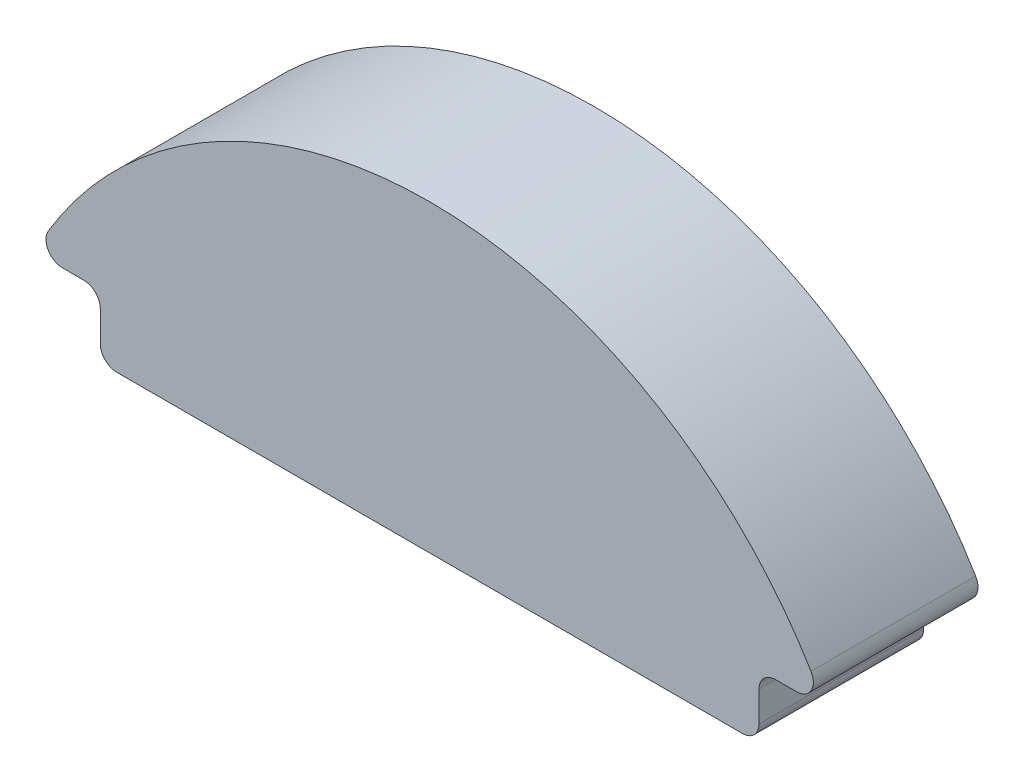
ISO-10303-21;
HEADER;
FILE_DESCRIPTION(('STEP AP214'),'2;1');
FILE_NAME('part.step','',(''),(''),'','','');
FILE_SCHEMA(('AUTOMOTIVE_DESIGN { 1 0 10303 214 1 1 1 1 }'));
ENDSEC;
DATA;
#1=APPLICATION_CONTEXT('core data for automotive mechanical design processes');
#2=APPLICATION_PROTOCOL_DEFINITION('international standard','automotive_design',2000,#1);
#3=PRODUCT_CONTEXT('',#1,'mechanical');
#4=PRODUCT('Part','Part','',(#3));
#5=PRODUCT_RELATED_PRODUCT_CATEGORY('part','',(#4));
#6=PRODUCT_DEFINITION_FORMATION('','',#4);
#7=PRODUCT_DEFINITION_CONTEXT('part definition',#1,'design');
#8=PRODUCT_DEFINITION('design','',#6,#7);
#9=PRODUCT_DEFINITION_SHAPE('','',#8);
#10=(LENGTH_UNIT() NAMED_UNIT(*) SI_UNIT(.MILLI.,.METRE.));
#11=(NAMED_UNIT(*) PLANE_ANGLE_UNIT() SI_UNIT($,.RADIAN.));
#12=(NAMED_UNIT(*) SI_UNIT($,.STERADIAN.) SOLID_ANGLE_UNIT());
#13=UNCERTAINTY_MEASURE_WITH_UNIT(LENGTH_MEASURE(1.E-05),#10,'distance_accuracy_value','');
#14=(GEOMETRIC_REPRESENTATION_CONTEXT(3) GLOBAL_UNCERTAINTY_ASSIGNED_CONTEXT((#13)) GLOBAL_UNIT_ASSIGNED_CONTEXT((#10,
#11,#12)) REPRESENTATION_CONTEXT('',''));
#15=CARTESIAN_POINT('',(0.,0.,0.));
#16=DIRECTION('',(0.,0.,1.));
#17=DIRECTION('',(1.,0.,0.));
#18=AXIS2_PLACEMENT_3D('',#15,#16,#17);
#19=CARTESIAN_POINT('',(127.386676948972,24.2,50.));
#20=DIRECTION('',(0.,0.,-1.));
#21=DIRECTION('',(-1.,0.,0.));
#22=AXIS2_PLACEMENT_3D('',#19,#20,#21);
#23=CYLINDRICAL_SURFACE('',#22,5.);
#24=CARTESIAN_POINT('',(127.386676948972,24.2,0.));
#25=DIRECTION('',(0.,0.,1.));
#26=DIRECTION('',(1.,0.,0.));
#27=AXIS2_PLACEMENT_3D('',#24,#25,#26);
#28=CIRCLE('',#27,5.);
#29=CARTESIAN_POINT('',(127.386676948972,19.2,0.));
#30=VERTEX_POINT('',#29);
#31=CARTESIAN_POINT('',(131.67501502173,26.7710224763179,0.));
#32=VERTEX_POINT('',#31);
#33=EDGE_CURVE('E248',#30,#32,#28,.T.);
#34=ORIENTED_EDGE('',*,*,#33,.T.);
#35=DIRECTION('',(0.,0.,-1.));
#36=VECTOR('',#35,1.);
#37=CARTESIAN_POINT('',(131.67501502173,26.7710224763179,50.));
#38=LINE('',#37,#36);
#39=CARTESIAN_POINT('',(131.67501502173,26.7710224763179,50.));
#40=VERTEX_POINT('',#39);
#41=EDGE_CURVE('E295',#40,#32,#38,.T.);
#42=ORIENTED_EDGE('',*,*,#41,.F.);
#43=CARTESIAN_POINT('',(127.386676948972,24.2,50.));
#44=DIRECTION('',(0.,0.,1.));
#45=DIRECTION('',(1.,0.,0.));
#46=AXIS2_PLACEMENT_3D('',#43,#44,#45);
#47=CIRCLE('',#46,5.);
#48=CARTESIAN_POINT('',(127.386676948972,19.2,50.));
#49=VERTEX_POINT('',#48);
#50=EDGE_CURVE('E270',#49,#40,#47,.T.);
#51=ORIENTED_EDGE('',*,*,#50,.F.);
#52=DIRECTION('',(0.,0.,-1.));
#53=VECTOR('',#52,1.);
#54=CARTESIAN_POINT('',(127.386676948972,19.2,50.));
#55=LINE('',#54,#53);
#56=EDGE_CURVE('E244',#49,#30,#55,.T.);
#57=ORIENTED_EDGE('',*,*,#56,.T.);
#58=EDGE_LOOP('',(#34,#42,#51,#57));
#59=FACE_BOUND('',#58,.T.);
#60=ADVANCED_FACE('F40',(#59),#23,.T.);
#61=CARTESIAN_POINT('',(15.8898870572563,-42.6465843842649,50.));
#62=DIRECTION('',(0.,0.,-1.));
#63=DIRECTION('',(-1.,0.,0.));
#64=AXIS2_PLACEMENT_3D('',#61,#62,#63);
#65=CYLINDRICAL_SURFACE('',#64,135.);
#66=CARTESIAN_POINT('',(15.8898870572563,-42.6465843842649,0.));
#67=DIRECTION('',(0.,0.,1.));
#68=DIRECTION('',(-1.,0.,0.));
#69=AXIS2_PLACEMENT_3D('',#66,#67,#68);
#70=CIRCLE('',#69,135.);
#71=CARTESIAN_POINT('',(-99.8952409072175,26.7710224763179,0.));
#72=VERTEX_POINT('',#71);
#73=EDGE_CURVE('E251',#32,#72,#70,.T.);
#74=ORIENTED_EDGE('',*,*,#73,.T.);
#75=DIRECTION('',(0.,0.,-1.));
#76=VECTOR('',#75,1.);
#77=CARTESIAN_POINT('',(-99.8952409072175,26.7710224763179,50.));
#78=LINE('',#77,#76);
#79=CARTESIAN_POINT('',(-99.8952409072175,26.7710224763179,50.));
#80=VERTEX_POINT('',#79);
#81=EDGE_CURVE('E292',#80,#72,#78,.T.);
#82=ORIENTED_EDGE('',*,*,#81,.F.);
#83=CARTESIAN_POINT('',(15.8898870572563,-42.6465843842649,50.));
#84=DIRECTION('',(0.,0.,1.));
#85=DIRECTION('',(-1.,0.,0.));
#86=AXIS2_PLACEMENT_3D('',#83,#84,#85);
#87=CIRCLE('',#86,135.);
#88=EDGE_CURVE('E199',#40,#80,#87,.T.);
#89=ORIENTED_EDGE('',*,*,#88,.F.);
#90=ORIENTED_EDGE('',*,*,#41,.T.);
#91=EDGE_LOOP('',(#74,#82,#89,#90));
#92=FACE_BOUND('',#91,.T.);
#93=ADVANCED_FACE('F631',(#92),#65,.T.);
#94=CARTESIAN_POINT('',(-95.6069028344592,24.2,50.));
#95=DIRECTION('',(0.,0.,-1.));
#96=DIRECTION('',(-1.,0.,0.));
#97=AXIS2_PLACEMENT_3D('',#94,#95,#96);
#98=CYLINDRICAL_SURFACE('',#97,5.);
#99=CARTESIAN_POINT('',(-95.6069028344592,24.2,0.));
#100=DIRECTION('',(0.,0.,1.));
#101=DIRECTION('',(-1.,0.,0.));
#102=AXIS2_PLACEMENT_3D('',#99,#100,#101);
#103=CIRCLE('',#102,5.);
#104=CARTESIAN_POINT('',(-95.6069028344592,19.2,0.));
#105=VERTEX_POINT('',#104);
#106=EDGE_CURVE('E253',#72,#105,#103,.T.);
#107=ORIENTED_EDGE('',*,*,#106,.T.);
#108=DIRECTION('',(0.,0.,-1.));
#109=VECTOR('',#108,1.);
#110=CARTESIAN_POINT('',(-95.6069028344592,19.2,50.));
#111=LINE('',#110,#109);
#112=CARTESIAN_POINT('',(-95.6069028344592,19.2,50.));
#113=VERTEX_POINT('',#112);
#114=EDGE_CURVE('E289',#113,#105,#111,.T.);
#115=ORIENTED_EDGE('',*,*,#114,.F.);
#116=CARTESIAN_POINT('',(-95.6069028344592,24.2,50.));
#117=DIRECTION('',(0.,0.,1.));
#118=DIRECTION('',(-1.,0.,0.));
#119=AXIS2_PLACEMENT_3D('',#116,#117,#118);
#120=CIRCLE('',#119,5.);
#121=EDGE_CURVE('E682',#80,#113,#120,.T.);
#122=ORIENTED_EDGE('',*,*,#121,.F.);
#123=ORIENTED_EDGE('',*,*,#81,.T.);
#124=EDGE_LOOP('',(#107,#115,#122,#123));
#125=FACE_BOUND('',#124,.T.);
#126=ADVANCED_FACE('F622',(#125),#98,.T.);
#127=CARTESIAN_POINT('',(-89.1101129427438,19.2,50.));
#128=DIRECTION('',(0.,1.,0.));
#129=DIRECTION('',(0.,0.,1.));
#130=AXIS2_PLACEMENT_3D('',#127,#128,#129);
#131=PLANE('',#130);
#132=DIRECTION('',(1.,0.,0.));
#133=VECTOR('',#132,1.);
#134=CARTESIAN_POINT('',(-89.1101129427438,19.2,0.));
#135=LINE('',#134,#133);
#136=CARTESIAN_POINT('',(-89.1101129427438,19.2,0.));
#137=VERTEX_POINT('',#136);
#138=EDGE_CURVE('E255',#105,#137,#135,.T.);
#139=ORIENTED_EDGE('',*,*,#138,.T.);
#140=DIRECTION('',(0.,0.,-1.));
#141=VECTOR('',#140,1.);
#142=CARTESIAN_POINT('',(-89.1101129427438,19.2,50.));
#143=LINE('',#142,#141);
#144=CARTESIAN_POINT('',(-89.1101129427438,19.2,50.));
#145=VERTEX_POINT('',#144);
#146=EDGE_CURVE('E286',#145,#137,#143,.T.);
#147=ORIENTED_EDGE('',*,*,#146,.F.);
#148=DIRECTION('',(1.,0.,0.));
#149=VECTOR('',#148,1.);
#150=CARTESIAN_POINT('',(-89.1101129427438,19.2,50.));
#151=LINE('',#150,#149);
#152=EDGE_CURVE('E684',#113,#145,#151,.T.);
#153=ORIENTED_EDGE('',*,*,#152,.F.);
#154=ORIENTED_EDGE('',*,*,#114,.T.);
#155=EDGE_LOOP('',(#139,#147,#153,#154));
#156=FACE_BOUND('',#155,.T.);
#157=ADVANCED_FACE('F613',(#156),#131,.F.);
#158=CARTESIAN_POINT('',(-89.1101129427438,14.2,50.));
#159=DIRECTION('',(0.,0.,-1.));
#160=DIRECTION('',(-1.,0.,0.));
#161=AXIS2_PLACEMENT_3D('',#158,#159,#160);
#162=CYLINDRICAL_SURFACE('',#161,5.);
#163=CARTESIAN_POINT('',(-89.1101129427438,14.2,0.));
#164=DIRECTION('',(0.,0.,-1.));
#165=DIRECTION('',(1.,0.,0.));
#166=AXIS2_PLACEMENT_3D('',#163,#164,#165);
#167=CIRCLE('',#166,5.);
#168=CARTESIAN_POINT('',(-84.1101129427437,14.2,0.));
#169=VERTEX_POINT('',#168);
#170=EDGE_CURVE('E257',#137,#169,#167,.T.);
#171=ORIENTED_EDGE('',*,*,#170,.T.);
#172=DIRECTION('',(0.,0.,-1.));
#173=VECTOR('',#172,1.);
#174=CARTESIAN_POINT('',(-84.1101129427437,14.2,50.));
#175=LINE('',#174,#173);
#176=CARTESIAN_POINT('',(-84.1101129427437,14.2,50.));
#177=VERTEX_POINT('',#176);
#178=EDGE_CURVE('E283',#177,#169,#175,.T.);
#179=ORIENTED_EDGE('',*,*,#178,.F.);
#180=CARTESIAN_POINT('',(-89.1101129427438,14.2,50.));
#181=DIRECTION('',(0.,0.,-1.));
#182=DIRECTION('',(1.,0.,0.));
#183=AXIS2_PLACEMENT_3D('',#180,#181,#182);
#184=CIRCLE('',#183,5.);
#185=EDGE_CURVE('E686',#145,#177,#184,.T.);
#186=ORIENTED_EDGE('',*,*,#185,.F.);
#187=ORIENTED_EDGE('',*,*,#146,.T.);
#188=EDGE_LOOP('',(#171,#179,#186,#187));
#189=FACE_BOUND('',#188,.T.);
#190=ADVANCED_FACE('F604',(#189),#162,.F.);
#191=CARTESIAN_POINT('',(-84.1101129427437,5.00000000000004,50.));
#192=DIRECTION('',(1.,0.,0.));
#193=DIRECTION('',(0.,0.,-1.));
#194=AXIS2_PLACEMENT_3D('',#191,#192,#193);
#195=PLANE('',#194);
#196=DIRECTION('',(0.,-1.,0.));
#197=VECTOR('',#196,1.);
#198=CARTESIAN_POINT('',(-84.1101129427437,5.00000000000004,0.));
#199=LINE('',#198,#197);
#200=CARTESIAN_POINT('',(-84.1101129427437,5.,0.));
#201=VERTEX_POINT('',#200);
#202=EDGE_CURVE('E259',#169,#201,#199,.T.);
#203=ORIENTED_EDGE('',*,*,#202,.T.);
#204=DIRECTION('',(0.,0.,-1.));
#205=VECTOR('',#204,1.);
#206=CARTESIAN_POINT('',(-84.1101129427437,5.,50.));
#207=LINE('',#206,#205);
#208=CARTESIAN_POINT('',(-84.1101129427437,5.,50.));
#209=VERTEX_POINT('',#208);
#210=EDGE_CURVE('E280',#209,#201,#207,.T.);
#211=ORIENTED_EDGE('',*,*,#210,.F.);
#212=DIRECTION('',(0.,-1.,0.));
#213=VECTOR('',#212,1.);
#214=CARTESIAN_POINT('',(-84.1101129427437,5.00000000000004,50.));
#215=LINE('',#214,#213);
#216=EDGE_CURVE('E692',#177,#209,#215,.T.);
#217=ORIENTED_EDGE('',*,*,#216,.F.);
#218=ORIENTED_EDGE('',*,*,#178,.T.);
#219=EDGE_LOOP('',(#203,#211,#217,#218));
#220=FACE_BOUND('',#219,.T.);
#221=ADVANCED_FACE('F595',(#220),#195,.F.);
#222=CARTESIAN_POINT('',(-79.1101129427437,5.,50.));
#223=DIRECTION('',(0.,0.,-1.));
#224=DIRECTION('',(-1.,0.,0.));
#225=AXIS2_PLACEMENT_3D('',#222,#223,#224);
#226=CYLINDRICAL_SURFACE('',#225,5.);
#227=CARTESIAN_POINT('',(-79.1101129427437,5.,0.));
#228=DIRECTION('',(0.,0.,1.));
#229=DIRECTION('',(-1.,0.,0.));
#230=AXIS2_PLACEMENT_3D('',#227,#228,#229);
#231=CIRCLE('',#230,5.);
#232=CARTESIAN_POINT('',(-79.1101129427437,0.,0.));
#233=VERTEX_POINT('',#232);
#234=EDGE_CURVE('E261',#201,#233,#231,.T.);
#235=ORIENTED_EDGE('',*,*,#234,.T.);
#236=DIRECTION('',(0.,0.,-1.));
#237=VECTOR('',#236,1.);
#238=CARTESIAN_POINT('',(-79.1101129427437,0.,50.));
#239=LINE('',#238,#237);
#240=CARTESIAN_POINT('',(-79.1101129427437,0.,50.));
#241=VERTEX_POINT('',#240);
#242=EDGE_CURVE('E277',#241,#233,#239,.T.);
#243=ORIENTED_EDGE('',*,*,#242,.F.);
#244=CARTESIAN_POINT('',(-79.1101129427437,5.,50.));
#245=DIRECTION('',(0.,0.,1.));
#246=DIRECTION('',(-1.,0.,0.));
#247=AXIS2_PLACEMENT_3D('',#244,#245,#246);
#248=CIRCLE('',#247,5.);
#249=EDGE_CURVE('E694',#209,#241,#248,.T.);
#250=ORIENTED_EDGE('',*,*,#249,.F.);
#251=ORIENTED_EDGE('',*,*,#210,.T.);
#252=EDGE_LOOP('',(#235,#243,#250,#251));
#253=FACE_BOUND('',#252,.T.);
#254=ADVANCED_FACE('F586',(#253),#226,.T.);
#255=CARTESIAN_POINT('',(-79.1101129427437,0.,50.));
#256=DIRECTION('',(0.,1.,0.));
#257=DIRECTION('',(0.,0.,1.));
#258=AXIS2_PLACEMENT_3D('',#255,#256,#257);
#259=PLANE('',#258);
#260=DIRECTION('',(1.,0.,0.));
#261=VECTOR('',#260,1.);
#262=CARTESIAN_POINT('',(-79.1101129427437,0.,0.));
#263=LINE('',#262,#261);
#264=CARTESIAN_POINT('',(110.889887057256,0.,0.));
#265=VERTEX_POINT('',#264);
#266=EDGE_CURVE('E263',#233,#265,#263,.T.);
#267=ORIENTED_EDGE('',*,*,#266,.T.);
#268=DIRECTION('',(0.,0.,-1.));
#269=VECTOR('',#268,1.);
#270=CARTESIAN_POINT('',(110.889887057256,0.,50.));
#271=LINE('',#270,#269);
#272=CARTESIAN_POINT('',(110.889887057256,0.,50.));
#273=VERTEX_POINT('',#272);
#274=EDGE_CURVE('E274',#273,#265,#271,.T.);
#275=ORIENTED_EDGE('',*,*,#274,.F.);
#276=DIRECTION('',(1.,0.,0.));
#277=VECTOR('',#276,1.);
#278=CARTESIAN_POINT('',(-79.1101129427437,0.,50.));
#279=LINE('',#278,#277);
#280=EDGE_CURVE('E696',#241,#273,#279,.T.);
#281=ORIENTED_EDGE('',*,*,#280,.F.);
#282=ORIENTED_EDGE('',*,*,#242,.T.);
#283=EDGE_LOOP('',(#267,#275,#281,#282));
#284=FACE_BOUND('',#283,.T.);
#285=ADVANCED_FACE('F577',(#284),#259,.F.);
#286=CARTESIAN_POINT('',(110.889887057256,5.,50.));
#287=DIRECTION('',(0.,0.,-1.));
#288=DIRECTION('',(-1.,0.,0.));
#289=AXIS2_PLACEMENT_3D('',#286,#287,#288);
#290=CYLINDRICAL_SURFACE('',#289,5.);
#291=CARTESIAN_POINT('',(110.889887057256,5.,0.));
#292=DIRECTION('',(0.,0.,1.));
#293=DIRECTION('',(1.,0.,0.));
#294=AXIS2_PLACEMENT_3D('',#291,#292,#293);
#295=CIRCLE('',#294,5.);
#296=CARTESIAN_POINT('',(115.889887057256,5.00000000000003,0.));
#297=VERTEX_POINT('',#296);
#298=EDGE_CURVE('E265',#265,#297,#295,.T.);
#299=ORIENTED_EDGE('',*,*,#298,.T.);
#300=DIRECTION('',(0.,0.,-1.));
#301=VECTOR('',#300,1.);
#302=CARTESIAN_POINT('',(115.889887057256,5.00000000000003,50.));
#303=LINE('',#302,#301);
#304=CARTESIAN_POINT('',(115.889887057256,5.00000000000003,50.));
#305=VERTEX_POINT('',#304);
#306=EDGE_CURVE('E239',#305,#297,#303,.T.);
#307=ORIENTED_EDGE('',*,*,#306,.F.);
#308=CARTESIAN_POINT('',(110.889887057256,5.,50.));
#309=DIRECTION('',(0.,0.,1.));
#310=DIRECTION('',(1.,0.,0.));
#311=AXIS2_PLACEMENT_3D('',#308,#309,#310);
#312=CIRCLE('',#311,5.);
#313=EDGE_CURVE('E230',#273,#305,#312,.T.);
#314=ORIENTED_EDGE('',*,*,#313,.F.);
#315=ORIENTED_EDGE('',*,*,#274,.T.);
#316=EDGE_LOOP('',(#299,#307,#314,#315));
#317=FACE_BOUND('',#316,.T.);
#318=ADVANCED_FACE('F569',(#317),#290,.T.);
#319=CARTESIAN_POINT('',(115.889887057256,5.00000000000003,50.));
#320=DIRECTION('',(-1.,0.,0.));
#321=DIRECTION('',(0.,0.,1.));
#322=AXIS2_PLACEMENT_3D('',#319,#320,#321);
#323=PLANE('',#322);
#324=DIRECTION('',(0.,1.,0.));
#325=VECTOR('',#324,1.);
#326=CARTESIAN_POINT('',(115.889887057256,5.00000000000003,0.));
#327=LINE('',#326,#325);
#328=CARTESIAN_POINT('',(115.889887057256,14.2,0.));
#329=VERTEX_POINT('',#328);
#330=EDGE_CURVE('E238',#297,#329,#327,.T.);
#331=ORIENTED_EDGE('',*,*,#330,.T.);
#332=DIRECTION('',(0.,0.,-1.));
#333=VECTOR('',#332,1.);
#334=CARTESIAN_POINT('',(115.889887057256,14.2,50.));
#335=LINE('',#334,#333);
#336=CARTESIAN_POINT('',(115.889887057256,14.2,50.));
#337=VERTEX_POINT('',#336);
#338=EDGE_CURVE('E235',#337,#329,#335,.T.);
#339=ORIENTED_EDGE('',*,*,#338,.F.);
#340=DIRECTION('',(0.,1.,0.));
#341=VECTOR('',#340,1.);
#342=CARTESIAN_POINT('',(115.889887057256,5.00000000000003,50.));
#343=LINE('',#342,#341);
#344=EDGE_CURVE('E224',#305,#337,#343,.T.);
#345=ORIENTED_EDGE('',*,*,#344,.F.);
#346=ORIENTED_EDGE('',*,*,#306,.T.);
#347=EDGE_LOOP('',(#331,#339,#345,#346));
#348=FACE_BOUND('',#347,.T.);
#349=ADVANCED_FACE('F236',(#348),#323,.F.);
#350=CARTESIAN_POINT('',(120.889887057256,14.2,50.));
#351=DIRECTION('',(0.,0.,-1.));
#352=DIRECTION('',(-1.,0.,0.));
#353=AXIS2_PLACEMENT_3D('',#350,#351,#352);
#354=CYLINDRICAL_SURFACE('',#353,5.);
#355=CARTESIAN_POINT('',(120.889887057256,14.2,0.));
#356=DIRECTION('',(0.,0.,-1.));
#357=DIRECTION('',(-1.,0.,0.));
#358=AXIS2_PLACEMENT_3D('',#355,#356,#357);
#359=CIRCLE('',#358,5.);
#360=CARTESIAN_POINT('',(120.889887057256,19.2,0.));
#361=VERTEX_POINT('',#360);
#362=EDGE_CURVE('E184',#329,#361,#359,.T.);
#363=ORIENTED_EDGE('',*,*,#362,.T.);
#364=DIRECTION('',(0.,0.,-1.));
#365=VECTOR('',#364,1.);
#366=CARTESIAN_POINT('',(120.889887057256,19.2,50.));
#367=LINE('',#366,#365);
#368=CARTESIAN_POINT('',(120.889887057256,19.2,50.));
#369=VERTEX_POINT('',#368);
#370=EDGE_CURVE('E240',#369,#361,#367,.T.);
#371=ORIENTED_EDGE('',*,*,#370,.F.);
#372=CARTESIAN_POINT('',(120.889887057256,14.2,50.));
#373=DIRECTION('',(0.,0.,-1.));
#374=DIRECTION('',(-1.,0.,0.));
#375=AXIS2_PLACEMENT_3D('',#372,#373,#374);
#376=CIRCLE('',#375,5.);
#377=EDGE_CURVE('E228',#337,#369,#376,.T.);
#378=ORIENTED_EDGE('',*,*,#377,.F.);
#379=ORIENTED_EDGE('',*,*,#338,.T.);
#380=EDGE_LOOP('',(#363,#371,#378,#379));
#381=FACE_BOUND('',#380,.T.);
#382=ADVANCED_FACE('F242',(#381),#354,.F.);
#383=CARTESIAN_POINT('',(120.889887057256,19.2,50.));
#384=DIRECTION('',(0.,1.,0.));
#385=DIRECTION('',(0.,0.,1.));
#386=AXIS2_PLACEMENT_3D('',#383,#384,#385);
#387=PLANE('',#386);
#388=DIRECTION('',(1.,0.,0.));
#389=VECTOR('',#388,1.);
#390=CARTESIAN_POINT('',(120.889887057256,19.2,0.));
#391=LINE('',#390,#389);
#392=EDGE_CURVE('E190',#361,#30,#391,.T.);
#393=ORIENTED_EDGE('',*,*,#392,.T.);
#394=ORIENTED_EDGE('',*,*,#56,.F.);
#395=DIRECTION('',(1.,0.,0.));
#396=VECTOR('',#395,1.);
#397=CARTESIAN_POINT('',(120.889887057256,19.2,50.));
#398=LINE('',#397,#396);
#399=EDGE_CURVE('E143',#369,#49,#398,.T.);
#400=ORIENTED_EDGE('',*,*,#399,.F.);
#401=ORIENTED_EDGE('',*,*,#370,.T.);
#402=EDGE_LOOP('',(#393,#394,#400,#401));
#403=FACE_BOUND('',#402,.T.);
#404=ADVANCED_FACE('F546',(#403),#387,.F.);
#405=CARTESIAN_POINT('',(127.386676948972,24.2,50.));
#406=DIRECTION('',(0.,0.,1.));
#407=DIRECTION('',(1.,0.,0.));
#408=AXIS2_PLACEMENT_3D('',#405,#406,#407);
#409=PLANE('',#408);
#410=ORIENTED_EDGE('',*,*,#50,.T.);
#411=ORIENTED_EDGE('',*,*,#88,.T.);
#412=ORIENTED_EDGE('',*,*,#121,.T.);
#413=ORIENTED_EDGE('',*,*,#152,.T.);
#414=ORIENTED_EDGE('',*,*,#185,.T.);
#415=ORIENTED_EDGE('',*,*,#216,.T.);
#416=ORIENTED_EDGE('',*,*,#249,.T.);
#417=ORIENTED_EDGE('',*,*,#280,.T.);
#418=ORIENTED_EDGE('',*,*,#313,.T.);
#419=ORIENTED_EDGE('',*,*,#344,.T.);
#420=ORIENTED_EDGE('',*,*,#377,.T.);
#421=ORIENTED_EDGE('',*,*,#399,.T.);
#422=EDGE_LOOP('',(#410,#411,#412,#413,#414,#415,#416,#417,#418,#419,#420,#421));
#423=FACE_BOUND('',#422,.T.);
#424=ADVANCED_FACE('F226',(#423),#409,.T.);
#425=CARTESIAN_POINT('',(127.386676948972,24.2,0.));
#426=DIRECTION('',(0.,0.,1.));
#427=DIRECTION('',(1.,0.,0.));
#428=AXIS2_PLACEMENT_3D('',#425,#426,#427);
#429=PLANE('',#428);
#430=ORIENTED_EDGE('',*,*,#33,.F.);
#431=ORIENTED_EDGE('',*,*,#392,.F.);
#432=ORIENTED_EDGE('',*,*,#362,.F.);
#433=ORIENTED_EDGE('',*,*,#330,.F.);
#434=ORIENTED_EDGE('',*,*,#298,.F.);
#435=ORIENTED_EDGE('',*,*,#266,.F.);
#436=ORIENTED_EDGE('',*,*,#234,.F.);
#437=ORIENTED_EDGE('',*,*,#202,.F.);
#438=ORIENTED_EDGE('',*,*,#170,.F.);
#439=ORIENTED_EDGE('',*,*,#138,.F.);
#440=ORIENTED_EDGE('',*,*,#106,.F.);
#441=ORIENTED_EDGE('',*,*,#73,.F.);
#442=EDGE_LOOP('',(#430,#431,#432,#433,#434,#435,#436,#437,#438,#439,#440,#441));
#443=FACE_BOUND('',#442,.T.);
#444=ADVANCED_FACE('F534',(#443),#429,.F.);
#445=CLOSED_SHELL('',(#60,#93,#126,#157,#190,#221,#254,#285,#318,#349,#382,#404,#424,#444));
#446=CARTESIAN_POINT('',(127.386676948972,24.2,50.));
#447=DIRECTION('',(0.,0.,-1.));
#448=DIRECTION('',(-1.,0.,0.));
#449=AXIS2_PLACEMENT_3D('',#446,#447,#448);
#450=CYLINDRICAL_SURFACE('',#449,3.);
#451=CARTESIAN_POINT('',(127.386676948972,24.2,2.));
#452=DIRECTION('',(0.,0.,1.));
#453=DIRECTION('',(1.,0.,0.));
#454=AXIS2_PLACEMENT_3D('',#451,#452,#453);
#455=CIRCLE('',#454,3.);
#456=CARTESIAN_POINT('',(127.386676948972,21.2,2.));
#457=VERTEX_POINT('',#456);
#458=CARTESIAN_POINT('',(129.959679792627,25.7426134857907,2.));
#459=VERTEX_POINT('',#458);
#460=EDGE_CURVE('E44',#457,#459,#455,.T.);
#461=ORIENTED_EDGE('',*,*,#460,.F.);
#462=DIRECTION('',(0.,0.,-1.));
#463=VECTOR('',#462,1.);
#464=CARTESIAN_POINT('',(127.386676948972,21.2,50.));
#465=LINE('',#464,#463);
#466=CARTESIAN_POINT('',(127.386676948972,21.2,48.));
#467=VERTEX_POINT('',#466);
#468=EDGE_CURVE('E368',#467,#457,#465,.T.);
#469=ORIENTED_EDGE('',*,*,#468,.F.);
#470=CARTESIAN_POINT('',(127.386676948972,24.2,48.));
#471=DIRECTION('',(0.,0.,1.));
#472=DIRECTION('',(1.,0.,0.));
#473=AXIS2_PLACEMENT_3D('',#470,#471,#472);
#474=CIRCLE('',#473,3.);
#475=CARTESIAN_POINT('',(129.959679792627,25.7426134857907,48.));
#476=VERTEX_POINT('',#475);
#477=EDGE_CURVE('E315',#467,#476,#474,.T.);
#478=ORIENTED_EDGE('',*,*,#477,.T.);
#479=DIRECTION('',(0.,0.,-1.));
#480=VECTOR('',#479,1.);
#481=CARTESIAN_POINT('',(129.959679792627,25.7426134857907,50.));
#482=LINE('',#481,#480);
#483=EDGE_CURVE('E366',#476,#459,#482,.T.);
#484=ORIENTED_EDGE('',*,*,#483,.T.);
#485=EDGE_LOOP('',(#461,#469,#478,#484));
#486=FACE_BOUND('',#485,.T.);
#487=ADVANCED_FACE('F375',(#486),#450,.F.);
#488=CARTESIAN_POINT('',(15.8898870572563,-42.6465843842649,50.));
#489=DIRECTION('',(0.,0.,-1.));
#490=DIRECTION('',(-1.,0.,0.));
#491=AXIS2_PLACEMENT_3D('',#488,#489,#490);
#492=CYLINDRICAL_SURFACE('',#491,133.);
#493=CARTESIAN_POINT('',(15.8898870572563,-42.6465843842649,2.));
#494=DIRECTION('',(0.,0.,1.));
#495=DIRECTION('',(1.,0.,0.));
#496=AXIS2_PLACEMENT_3D('',#493,#494,#495);
#497=CIRCLE('',#496,133.);
#498=CARTESIAN_POINT('',(-98.1799056781142,25.7426134857907,2.));
#499=VERTEX_POINT('',#498);
#500=EDGE_CURVE('E60',#459,#499,#497,.T.);
#501=ORIENTED_EDGE('',*,*,#500,.F.);
#502=ORIENTED_EDGE('',*,*,#483,.F.);
#503=CARTESIAN_POINT('',(15.8898870572563,-42.6465843842649,48.));
#504=DIRECTION('',(0.,0.,1.));
#505=DIRECTION('',(1.,0.,0.));
#506=AXIS2_PLACEMENT_3D('',#503,#504,#505);
#507=CIRCLE('',#506,133.);
#508=CARTESIAN_POINT('',(-98.1799056781142,25.7426134857907,48.));
#509=VERTEX_POINT('',#508);
#510=EDGE_CURVE('E131',#476,#509,#507,.T.);
#511=ORIENTED_EDGE('',*,*,#510,.T.);
#512=DIRECTION('',(0.,0.,-1.));
#513=VECTOR('',#512,1.);
#514=CARTESIAN_POINT('',(-98.1799056781142,25.7426134857907,50.));
#515=LINE('',#514,#513);
#516=EDGE_CURVE('E362',#509,#499,#515,.T.);
#517=ORIENTED_EDGE('',*,*,#516,.T.);
#518=EDGE_LOOP('',(#501,#502,#511,#517));
#519=FACE_BOUND('',#518,.T.);
#520=ADVANCED_FACE('F376',(#519),#492,.F.);
#521=CARTESIAN_POINT('',(-95.6069028344592,24.2,50.));
#522=DIRECTION('',(0.,0.,-1.));
#523=DIRECTION('',(-1.,0.,0.));
#524=AXIS2_PLACEMENT_3D('',#521,#522,#523);
#525=CYLINDRICAL_SURFACE('',#524,3.);
#526=CARTESIAN_POINT('',(-95.6069028344592,24.2,2.));
#527=DIRECTION('',(0.,0.,1.));
#528=DIRECTION('',(1.,0.,0.));
#529=AXIS2_PLACEMENT_3D('',#526,#527,#528);
#530=CIRCLE('',#529,3.);
#531=CARTESIAN_POINT('',(-95.6069028344592,21.2,2.));
#532=VERTEX_POINT('',#531);
#533=EDGE_CURVE('E364',#499,#532,#530,.T.);
#534=ORIENTED_EDGE('',*,*,#533,.F.);
#535=ORIENTED_EDGE('',*,*,#516,.F.);
#536=CARTESIAN_POINT('',(-95.6069028344592,24.2,48.));
#537=DIRECTION('',(0.,0.,1.));
#538=DIRECTION('',(1.,0.,0.));
#539=AXIS2_PLACEMENT_3D('',#536,#537,#538);
#540=CIRCLE('',#539,3.);
#541=CARTESIAN_POINT('',(-95.6069028344592,21.2,48.));
#542=VERTEX_POINT('',#541);
#543=EDGE_CURVE('E312',#509,#542,#540,.T.);
#544=ORIENTED_EDGE('',*,*,#543,.T.);
#545=DIRECTION('',(0.,0.,1.));
#546=VECTOR('',#545,1.);
#547=CARTESIAN_POINT('',(-95.6069028344592,21.2,50.));
#548=LINE('',#547,#546);
#549=EDGE_CURVE('E357',#542,#532,#548,.F.);
#550=ORIENTED_EDGE('',*,*,#549,.T.);
#551=EDGE_LOOP('',(#534,#535,#544,#550));
#552=FACE_BOUND('',#551,.T.);
#553=ADVANCED_FACE('F380',(#552),#525,.F.);
#554=CARTESIAN_POINT('',(-89.1101129427438,21.2,50.));
#555=DIRECTION('',(0.,1.,0.));
#556=DIRECTION('',(0.,0.,1.));
#557=AXIS2_PLACEMENT_3D('',#554,#555,#556);
#558=PLANE('',#557);
#559=DIRECTION('',(1.,0.,0.));
#560=VECTOR('',#559,1.);
#561=CARTESIAN_POINT('',(-89.1101129427438,21.2,2.));
#562=LINE('',#561,#560);
#563=CARTESIAN_POINT('',(-89.1101129427438,21.2,2.));
#564=VERTEX_POINT('',#563);
#565=EDGE_CURVE('E360',#532,#564,#562,.T.);
#566=ORIENTED_EDGE('',*,*,#565,.F.);
#567=ORIENTED_EDGE('',*,*,#549,.F.);
#568=DIRECTION('',(1.,0.,0.));
#569=VECTOR('',#568,1.);
#570=CARTESIAN_POINT('',(-89.1101129427438,21.2,48.));
#571=LINE('',#570,#569);
#572=CARTESIAN_POINT('',(-89.1101129427438,21.2,48.));
#573=VERTEX_POINT('',#572);
#574=EDGE_CURVE('E310',#542,#573,#571,.T.);
#575=ORIENTED_EDGE('',*,*,#574,.T.);
#576=DIRECTION('',(0.,0.,-1.));
#577=VECTOR('',#576,1.);
#578=CARTESIAN_POINT('',(-89.1101129427438,21.2,50.));
#579=LINE('',#578,#577);
#580=EDGE_CURVE('E352',#573,#564,#579,.T.);
#581=ORIENTED_EDGE('',*,*,#580,.T.);
#582=EDGE_LOOP('',(#566,#567,#575,#581));
#583=FACE_BOUND('',#582,.T.);
#584=ADVANCED_FACE('F389',(#583),#558,.T.);
#585=CARTESIAN_POINT('',(-89.1101129427438,14.2,50.));
#586=DIRECTION('',(0.,0.,-1.));
#587=DIRECTION('',(-1.,0.,0.));
#588=AXIS2_PLACEMENT_3D('',#585,#586,#587);
#589=CYLINDRICAL_SURFACE('',#588,7.);
#590=CARTESIAN_POINT('',(-89.1101129427438,14.2,2.));
#591=DIRECTION('',(0.,0.,1.));
#592=DIRECTION('',(1.,0.,0.));
#593=AXIS2_PLACEMENT_3D('',#590,#591,#592);
#594=CIRCLE('',#593,7.);
#595=CARTESIAN_POINT('',(-82.1101129427437,14.2,2.));
#596=VERTEX_POINT('',#595);
#597=EDGE_CURVE('E355',#564,#596,#594,.F.);
#598=ORIENTED_EDGE('',*,*,#597,.F.);
#599=ORIENTED_EDGE('',*,*,#580,.F.);
#600=CARTESIAN_POINT('',(-89.1101129427438,14.2,48.));
#601=DIRECTION('',(0.,0.,1.));
#602=DIRECTION('',(1.,0.,0.));
#603=AXIS2_PLACEMENT_3D('',#600,#601,#602);
#604=CIRCLE('',#603,7.);
#605=CARTESIAN_POINT('',(-82.1101129427437,14.2,48.));
#606=VERTEX_POINT('',#605);
#607=EDGE_CURVE('E308',#573,#606,#604,.F.);
#608=ORIENTED_EDGE('',*,*,#607,.T.);
#609=DIRECTION('',(0.,0.,-1.));
#610=VECTOR('',#609,1.);
#611=CARTESIAN_POINT('',(-82.1101129427437,14.2,50.));
#612=LINE('',#611,#610);
#613=EDGE_CURVE('E347',#606,#596,#612,.T.);
#614=ORIENTED_EDGE('',*,*,#613,.T.);
#615=EDGE_LOOP('',(#598,#599,#608,#614));
#616=FACE_BOUND('',#615,.T.);
#617=ADVANCED_FACE('F392',(#616),#589,.T.);
#618=CARTESIAN_POINT('',(-82.1101129427437,5.00000000000004,50.));
#619=DIRECTION('',(1.,0.,0.));
#620=DIRECTION('',(0.,0.,-1.));
#621=AXIS2_PLACEMENT_3D('',#618,#619,#620);
#622=PLANE('',#621);
#623=DIRECTION('',(0.,-1.,0.));
#624=VECTOR('',#623,1.);
#625=CARTESIAN_POINT('',(-82.1101129427437,5.00000000000004,2.));
#626=LINE('',#625,#624);
#627=CARTESIAN_POINT('',(-82.1101129427437,5.,2.));
#628=VERTEX_POINT('',#627);
#629=EDGE_CURVE('E350',#596,#628,#626,.T.);
#630=ORIENTED_EDGE('',*,*,#629,.F.);
#631=ORIENTED_EDGE('',*,*,#613,.F.);
#632=DIRECTION('',(0.,-1.,0.));
#633=VECTOR('',#632,1.);
#634=CARTESIAN_POINT('',(-82.1101129427437,5.00000000000004,48.));
#635=LINE('',#634,#633);
#636=CARTESIAN_POINT('',(-82.1101129427437,5.,48.));
#637=VERTEX_POINT('',#636);
#638=EDGE_CURVE('E306',#606,#637,#635,.T.);
#639=ORIENTED_EDGE('',*,*,#638,.T.);
#640=DIRECTION('',(0.,0.,-1.));
#641=VECTOR('',#640,1.);
#642=CARTESIAN_POINT('',(-82.1101129427437,5.,50.));
#643=LINE('',#642,#641);
#644=EDGE_CURVE('E342',#637,#628,#643,.T.);
#645=ORIENTED_EDGE('',*,*,#644,.T.);
#646=EDGE_LOOP('',(#630,#631,#639,#645));
#647=FACE_BOUND('',#646,.T.);
#648=ADVANCED_FACE('F398',(#647),#622,.T.);
#649=CARTESIAN_POINT('',(-79.1101129427437,5.,50.));
#650=DIRECTION('',(0.,0.,-1.));
#651=DIRECTION('',(-1.,0.,0.));
#652=AXIS2_PLACEMENT_3D('',#649,#650,#651);
#653=CYLINDRICAL_SURFACE('',#652,3.);
#654=CARTESIAN_POINT('',(-79.1101129427437,5.,2.));
#655=DIRECTION('',(0.,0.,1.));
#656=DIRECTION('',(1.,0.,0.));
#657=AXIS2_PLACEMENT_3D('',#654,#655,#656);
#658=CIRCLE('',#657,3.);
#659=CARTESIAN_POINT('',(-79.1101129427437,2.,2.));
#660=VERTEX_POINT('',#659);
#661=EDGE_CURVE('E345',#628,#660,#658,.T.);
#662=ORIENTED_EDGE('',*,*,#661,.F.);
#663=ORIENTED_EDGE('',*,*,#644,.F.);
#664=CARTESIAN_POINT('',(-79.1101129427437,5.,48.));
#665=DIRECTION('',(0.,0.,1.));
#666=DIRECTION('',(1.,0.,0.));
#667=AXIS2_PLACEMENT_3D('',#664,#665,#666);
#668=CIRCLE('',#667,3.);
#669=CARTESIAN_POINT('',(-79.1101129427437,2.,48.));
#670=VERTEX_POINT('',#669);
#671=EDGE_CURVE('E304',#637,#670,#668,.T.);
#672=ORIENTED_EDGE('',*,*,#671,.T.);
#673=DIRECTION('',(0.,0.,1.));
#674=VECTOR('',#673,1.);
#675=CARTESIAN_POINT('',(-79.1101129427437,2.,50.));
#676=LINE('',#675,#674);
#677=EDGE_CURVE('E337',#670,#660,#676,.F.);
#678=ORIENTED_EDGE('',*,*,#677,.T.);
#679=EDGE_LOOP('',(#662,#663,#672,#678));
#680=FACE_BOUND('',#679,.T.);
#681=ADVANCED_FACE('F401',(#680),#653,.F.);
#682=CARTESIAN_POINT('',(-79.1101129427437,2.,50.));
#683=DIRECTION('',(0.,1.,0.));
#684=DIRECTION('',(0.,0.,1.));
#685=AXIS2_PLACEMENT_3D('',#682,#683,#684);
#686=PLANE('',#685);
#687=DIRECTION('',(1.,0.,0.));
#688=VECTOR('',#687,1.);
#689=CARTESIAN_POINT('',(-79.1101129427437,2.,2.));
#690=LINE('',#689,#688);
#691=CARTESIAN_POINT('',(110.889887057256,2.,2.));
#692=VERTEX_POINT('',#691);
#693=EDGE_CURVE('E340',#660,#692,#690,.T.);
#694=ORIENTED_EDGE('',*,*,#693,.F.);
#695=ORIENTED_EDGE('',*,*,#677,.F.);
#696=DIRECTION('',(1.,0.,0.));
#697=VECTOR('',#696,1.);
#698=CARTESIAN_POINT('',(-79.1101129427437,2.,48.));
#699=LINE('',#698,#697);
#700=CARTESIAN_POINT('',(110.889887057256,2.,48.));
#701=VERTEX_POINT('',#700);
#702=EDGE_CURVE('E302',#670,#701,#699,.T.);
#703=ORIENTED_EDGE('',*,*,#702,.T.);
#704=DIRECTION('',(0.,0.,-1.));
#705=VECTOR('',#704,1.);
#706=CARTESIAN_POINT('',(110.889887057256,2.,50.));
#707=LINE('',#706,#705);
#708=EDGE_CURVE('E332',#701,#692,#707,.T.);
#709=ORIENTED_EDGE('',*,*,#708,.T.);
#710=EDGE_LOOP('',(#694,#695,#703,#709));
#711=FACE_BOUND('',#710,.T.);
#712=ADVANCED_FACE('F406',(#711),#686,.T.);
#713=CARTESIAN_POINT('',(110.889887057256,5.,50.));
#714=DIRECTION('',(0.,0.,-1.));
#715=DIRECTION('',(-1.,0.,0.));
#716=AXIS2_PLACEMENT_3D('',#713,#714,#715);
#717=CYLINDRICAL_SURFACE('',#716,3.);
#718=CARTESIAN_POINT('',(110.889887057256,5.,2.));
#719=DIRECTION('',(0.,0.,1.));
#720=DIRECTION('',(1.,0.,0.));
#721=AXIS2_PLACEMENT_3D('',#718,#719,#720);
#722=CIRCLE('',#721,3.);
#723=CARTESIAN_POINT('',(113.889887057256,5.00000000000003,2.));
#724=VERTEX_POINT('',#723);
#725=EDGE_CURVE('E335',#692,#724,#722,.T.);
#726=ORIENTED_EDGE('',*,*,#725,.F.);
#727=ORIENTED_EDGE('',*,*,#708,.F.);
#728=CARTESIAN_POINT('',(110.889887057256,5.,48.));
#729=DIRECTION('',(0.,0.,1.));
#730=DIRECTION('',(1.,0.,0.));
#731=AXIS2_PLACEMENT_3D('',#728,#729,#730);
#732=CIRCLE('',#731,3.);
#733=CARTESIAN_POINT('',(113.889887057256,5.00000000000003,48.));
#734=VERTEX_POINT('',#733);
#735=EDGE_CURVE('E300',#701,#734,#732,.T.);
#736=ORIENTED_EDGE('',*,*,#735,.T.);
#737=DIRECTION('',(0.,0.,1.));
#738=VECTOR('',#737,1.);
#739=CARTESIAN_POINT('',(113.889887057256,5.00000000000003,50.));
#740=LINE('',#739,#738);
#741=EDGE_CURVE('E327',#734,#724,#740,.F.);
#742=ORIENTED_EDGE('',*,*,#741,.T.);
#743=EDGE_LOOP('',(#726,#727,#736,#742));
#744=FACE_BOUND('',#743,.T.);
#745=ADVANCED_FACE('F412',(#744),#717,.F.);
#746=CARTESIAN_POINT('',(113.889887057256,5.00000000000003,50.));
#747=DIRECTION('',(-1.,0.,0.));
#748=DIRECTION('',(0.,0.,1.));
#749=AXIS2_PLACEMENT_3D('',#746,#747,#748);
#750=PLANE('',#749);
#751=DIRECTION('',(0.,1.,0.));
#752=VECTOR('',#751,1.);
#753=CARTESIAN_POINT('',(113.889887057256,5.00000000000003,2.));
#754=LINE('',#753,#752);
#755=CARTESIAN_POINT('',(113.889887057256,14.1999999999999,2.));
#756=VERTEX_POINT('',#755);
#757=EDGE_CURVE('E330',#724,#756,#754,.T.);
#758=ORIENTED_EDGE('',*,*,#757,.F.);
#759=ORIENTED_EDGE('',*,*,#741,.F.);
#760=DIRECTION('',(0.,1.,0.));
#761=VECTOR('',#760,1.);
#762=CARTESIAN_POINT('',(113.889887057256,5.00000000000003,48.));
#763=LINE('',#762,#761);
#764=CARTESIAN_POINT('',(113.889887057256,14.1999999999999,48.));
#765=VERTEX_POINT('',#764);
#766=EDGE_CURVE('E298',#734,#765,#763,.T.);
#767=ORIENTED_EDGE('',*,*,#766,.T.);
#768=DIRECTION('',(0.,0.,-1.));
#769=VECTOR('',#768,1.);
#770=CARTESIAN_POINT('',(113.889887057256,14.1999999999999,50.));
#771=LINE('',#770,#769);
#772=EDGE_CURVE('E322',#765,#756,#771,.T.);
#773=ORIENTED_EDGE('',*,*,#772,.T.);
#774=EDGE_LOOP('',(#758,#759,#767,#773));
#775=FACE_BOUND('',#774,.T.);
#776=ADVANCED_FACE('F416',(#775),#750,.T.);
#777=CARTESIAN_POINT('',(120.889887057256,14.2,50.));
#778=DIRECTION('',(0.,0.,-1.));
#779=DIRECTION('',(-1.,0.,0.));
#780=AXIS2_PLACEMENT_3D('',#777,#778,#779);
#781=CYLINDRICAL_SURFACE('',#780,7.);
#782=CARTESIAN_POINT('',(120.889887057256,14.2,2.));
#783=DIRECTION('',(0.,0.,1.));
#784=DIRECTION('',(1.,0.,0.));
#785=AXIS2_PLACEMENT_3D('',#782,#783,#784);
#786=CIRCLE('',#785,7.);
#787=CARTESIAN_POINT('',(120.889887057256,21.2,2.));
#788=VERTEX_POINT('',#787);
#789=EDGE_CURVE('E325',#756,#788,#786,.F.);
#790=ORIENTED_EDGE('',*,*,#789,.F.);
#791=ORIENTED_EDGE('',*,*,#772,.F.);
#792=CARTESIAN_POINT('',(120.889887057256,14.2,48.));
#793=DIRECTION('',(0.,0.,1.));
#794=DIRECTION('',(1.,0.,0.));
#795=AXIS2_PLACEMENT_3D('',#792,#793,#794);
#796=CIRCLE('',#795,7.);
#797=CARTESIAN_POINT('',(120.889887057256,21.2,48.));
#798=VERTEX_POINT('',#797);
#799=EDGE_CURVE('E51',#765,#798,#796,.F.);
#800=ORIENTED_EDGE('',*,*,#799,.T.);
#801=DIRECTION('',(0.,0.,1.));
#802=VECTOR('',#801,1.);
#803=CARTESIAN_POINT('',(120.889887057256,21.2,50.));
#804=LINE('',#803,#802);
#805=EDGE_CURVE('E317',#798,#788,#804,.F.);
#806=ORIENTED_EDGE('',*,*,#805,.T.);
#807=EDGE_LOOP('',(#790,#791,#800,#806));
#808=FACE_BOUND('',#807,.T.);
#809=ADVANCED_FACE('F421',(#808),#781,.T.);
#810=CARTESIAN_POINT('',(120.889887057256,21.2,50.));
#811=DIRECTION('',(0.,1.,0.));
#812=DIRECTION('',(0.,0.,1.));
#813=AXIS2_PLACEMENT_3D('',#810,#811,#812);
#814=PLANE('',#813);
#815=DIRECTION('',(1.,0.,0.));
#816=VECTOR('',#815,1.);
#817=CARTESIAN_POINT('',(120.889887057256,21.2,2.));
#818=LINE('',#817,#816);
#819=EDGE_CURVE('E320',#788,#457,#818,.T.);
#820=ORIENTED_EDGE('',*,*,#819,.F.);
#821=ORIENTED_EDGE('',*,*,#805,.F.);
#822=DIRECTION('',(1.,0.,0.));
#823=VECTOR('',#822,1.);
#824=CARTESIAN_POINT('',(120.889887057256,21.2,48.));
#825=LINE('',#824,#823);
#826=EDGE_CURVE('E11',#798,#467,#825,.T.);
#827=ORIENTED_EDGE('',*,*,#826,.T.);
#828=ORIENTED_EDGE('',*,*,#468,.T.);
#829=EDGE_LOOP('',(#820,#821,#827,#828));
#830=FACE_BOUND('',#829,.T.);
#831=ADVANCED_FACE('F424',(#830),#814,.T.);
#832=CARTESIAN_POINT('',(127.386676948972,24.2,48.));
#833=DIRECTION('',(0.,0.,1.));
#834=DIRECTION('',(1.,0.,0.));
#835=AXIS2_PLACEMENT_3D('',#832,#833,#834);
#836=PLANE('',#835);
#837=ORIENTED_EDGE('',*,*,#477,.F.);
#838=ORIENTED_EDGE('',*,*,#826,.F.);
#839=ORIENTED_EDGE('',*,*,#799,.F.);
#840=ORIENTED_EDGE('',*,*,#766,.F.);
#841=ORIENTED_EDGE('',*,*,#735,.F.);
#842=ORIENTED_EDGE('',*,*,#702,.F.);
#843=ORIENTED_EDGE('',*,*,#671,.F.);
#844=ORIENTED_EDGE('',*,*,#638,.F.);
#845=ORIENTED_EDGE('',*,*,#607,.F.);
#846=ORIENTED_EDGE('',*,*,#574,.F.);
#847=ORIENTED_EDGE('',*,*,#543,.F.);
#848=ORIENTED_EDGE('',*,*,#510,.F.);
#849=EDGE_LOOP('',(#837,#838,#839,#840,#841,#842,#843,#844,#845,#846,#847,#848));
#850=FACE_BOUND('',#849,.T.);
#851=ADVANCED_FACE('F383',(#850),#836,.F.);
#852=CARTESIAN_POINT('',(127.386676948972,24.2,2.));
#853=DIRECTION('',(0.,0.,1.));
#854=DIRECTION('',(1.,0.,0.));
#855=AXIS2_PLACEMENT_3D('',#852,#853,#854);
#856=PLANE('',#855);
#857=ORIENTED_EDGE('',*,*,#460,.T.);
#858=ORIENTED_EDGE('',*,*,#500,.T.);
#859=ORIENTED_EDGE('',*,*,#533,.T.);
#860=ORIENTED_EDGE('',*,*,#565,.T.);
#861=ORIENTED_EDGE('',*,*,#597,.T.);
#862=ORIENTED_EDGE('',*,*,#629,.T.);
#863=ORIENTED_EDGE('',*,*,#661,.T.);
#864=ORIENTED_EDGE('',*,*,#693,.T.);
#865=ORIENTED_EDGE('',*,*,#725,.T.);
#866=ORIENTED_EDGE('',*,*,#757,.T.);
#867=ORIENTED_EDGE('',*,*,#789,.T.);
#868=ORIENTED_EDGE('',*,*,#819,.T.);
#869=EDGE_LOOP('',(#857,#858,#859,#860,#861,#862,#863,#864,#865,#866,#867,#868));
#870=FACE_BOUND('',#869,.T.);
#871=ADVANCED_FACE('F42',(#870),#856,.T.);
#872=CLOSED_SHELL('',(#487,#520,#553,#584,#617,#648,#681,#712,#745,#776,#809,#831,#851,#871));
#873=ORIENTED_CLOSED_SHELL('',*,#872,.T.);
#874=BREP_WITH_VOIDS('B2',#445,(#873));
#875=ADVANCED_BREP_SHAPE_REPRESENTATION('',(#18,#874),#14);
#876=SHAPE_DEFINITION_REPRESENTATION(#9,#875);
ENDSEC;
END-ISO-10303-21;
